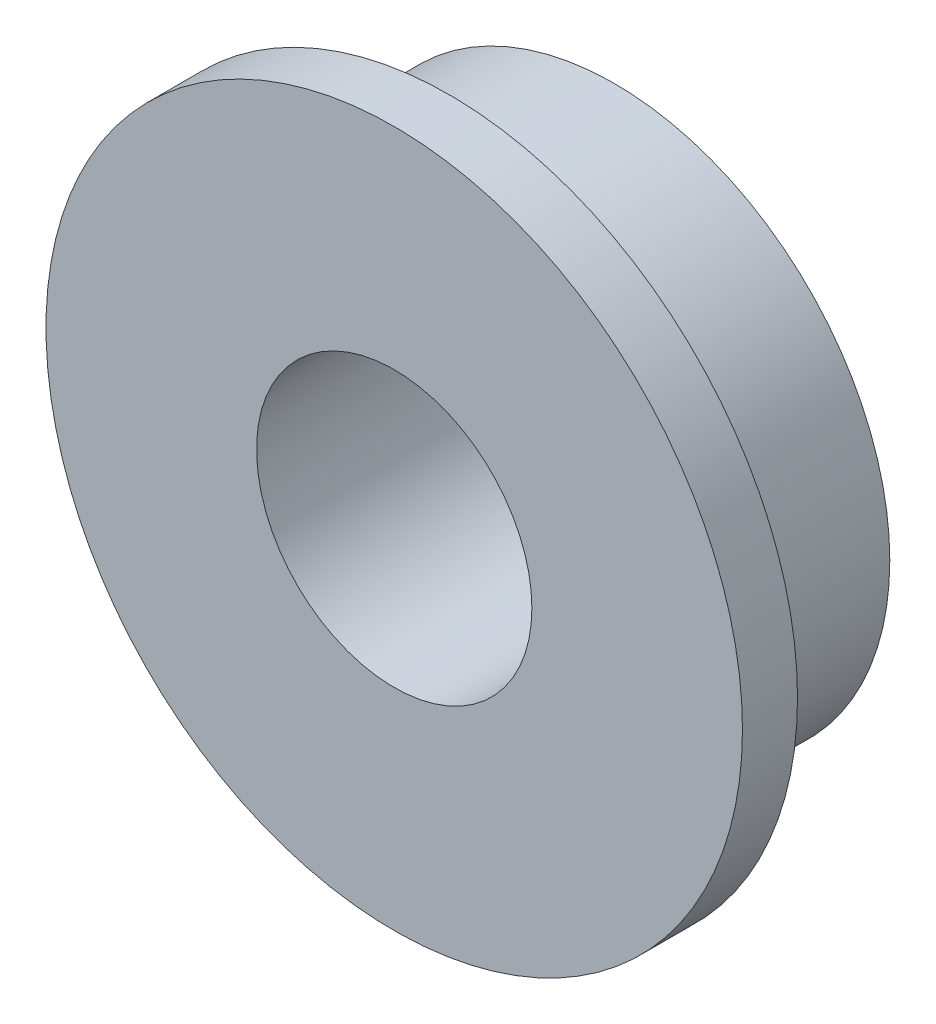
ISO-10303-21;
HEADER;
FILE_DESCRIPTION(('STEP AP214'),'2;1');
FILE_NAME('part.step','',(''),(''),'','','');
FILE_SCHEMA(('AUTOMOTIVE_DESIGN { 1 0 10303 214 1 1 1 1 }'));
ENDSEC;
DATA;
#1=APPLICATION_CONTEXT('core data for automotive mechanical design processes');
#2=APPLICATION_PROTOCOL_DEFINITION('international standard','automotive_design',2000,#1);
#3=PRODUCT_CONTEXT('',#1,'mechanical');
#4=PRODUCT('Part','Part','',(#3));
#5=PRODUCT_RELATED_PRODUCT_CATEGORY('part','',(#4));
#6=PRODUCT_DEFINITION_FORMATION('','',#4);
#7=PRODUCT_DEFINITION_CONTEXT('part definition',#1,'design');
#8=PRODUCT_DEFINITION('design','',#6,#7);
#9=PRODUCT_DEFINITION_SHAPE('','',#8);
#10=(LENGTH_UNIT() NAMED_UNIT(*) SI_UNIT(.MILLI.,.METRE.));
#11=(NAMED_UNIT(*) PLANE_ANGLE_UNIT() SI_UNIT($,.RADIAN.));
#12=(NAMED_UNIT(*) SI_UNIT($,.STERADIAN.) SOLID_ANGLE_UNIT());
#13=UNCERTAINTY_MEASURE_WITH_UNIT(LENGTH_MEASURE(1.E-05),#10,'distance_accuracy_value','');
#14=(GEOMETRIC_REPRESENTATION_CONTEXT(3) GLOBAL_UNCERTAINTY_ASSIGNED_CONTEXT((#13)) GLOBAL_UNIT_ASSIGNED_CONTEXT((#10,
#11,#12)) REPRESENTATION_CONTEXT('',''));
#15=CARTESIAN_POINT('',(0.,0.,0.));
#16=DIRECTION('',(0.,0.,1.));
#17=DIRECTION('',(1.,0.,0.));
#18=AXIS2_PLACEMENT_3D('',#15,#16,#17);
#19=CARTESIAN_POINT('',(0.690540980360563,1.46891454845607,4.));
#20=DIRECTION('',(0.,0.,-1.));
#21=DIRECTION('',(-1.,0.,0.));
#22=AXIS2_PLACEMENT_3D('',#19,#20,#21);
#23=CYLINDRICAL_SURFACE('',#22,5.);
#24=CARTESIAN_POINT('',(0.690540980360563,1.46891454845607,0.));
#25=DIRECTION('',(0.,0.,1.));
#26=DIRECTION('',(1.,0.,0.));
#27=AXIS2_PLACEMENT_3D('',#24,#25,#26);
#28=CIRCLE('',#27,5.);
#29=CARTESIAN_POINT('',(5.69054098036056,1.46891454845607,0.));
#30=VERTEX_POINT('',#29);
#31=EDGE_CURVE('E34',#30,#30,#28,.T.);
#32=ORIENTED_EDGE('',*,*,#31,.T.);
#33=EDGE_LOOP('',(#32));
#34=FACE_BOUND('',#33,.T.);
#35=CARTESIAN_POINT('',(0.690540980360563,1.46891454845607,3.));
#36=DIRECTION('',(0.,0.,1.));
#37=DIRECTION('',(1.,0.,0.));
#38=AXIS2_PLACEMENT_3D('',#35,#36,#37);
#39=CIRCLE('',#38,5.);
#40=CARTESIAN_POINT('',(5.69054098036056,1.46891454845607,3.));
#41=VERTEX_POINT('',#40);
#42=EDGE_CURVE('E10',#41,#41,#39,.T.);
#43=ORIENTED_EDGE('',*,*,#42,.F.);
#44=EDGE_LOOP('',(#43));
#45=FACE_BOUND('',#44,.T.);
#46=ADVANCED_FACE('F31',(#34,#45),#23,.T.);
#47=CARTESIAN_POINT('',(0.690540980360563,1.46891454845607,4.));
#48=DIRECTION('',(0.,0.,1.));
#49=DIRECTION('',(1.,0.,0.));
#50=AXIS2_PLACEMENT_3D('',#47,#48,#49);
#51=PLANE('',#50);
#52=CARTESIAN_POINT('',(0.690540980360563,1.46891454845607,4.));
#53=DIRECTION('',(0.,0.,1.));
#54=DIRECTION('',(1.,0.,0.));
#55=AXIS2_PLACEMENT_3D('',#52,#53,#54);
#56=CIRCLE('',#55,2.5);
#57=CARTESIAN_POINT('',(3.19054098036056,1.46891454845607,4.));
#58=VERTEX_POINT('',#57);
#59=EDGE_CURVE('E42',#58,#58,#56,.T.);
#60=ORIENTED_EDGE('',*,*,#59,.F.);
#61=EDGE_LOOP('',(#60));
#62=FACE_BOUND('',#61,.T.);
#63=CARTESIAN_POINT('',(0.690540980360563,1.46891454845607,4.));
#64=DIRECTION('',(0.,0.,1.));
#65=DIRECTION('',(1.,0.,0.));
#66=AXIS2_PLACEMENT_3D('',#63,#64,#65);
#67=CIRCLE('',#66,6.32420063757325);
#68=CARTESIAN_POINT('',(7.01474161793381,1.46891454845607,4.));
#69=VERTEX_POINT('',#68);
#70=EDGE_CURVE('E45',#69,#69,#67,.T.);
#71=ORIENTED_EDGE('',*,*,#70,.T.);
#72=EDGE_LOOP('',(#71));
#73=FACE_BOUND('',#72,.T.);
#74=ADVANCED_FACE('F59',(#62,#73),#51,.T.);
#75=CARTESIAN_POINT('',(0.690540980360563,1.46891454845607,0.));
#76=DIRECTION('',(0.,0.,1.));
#77=DIRECTION('',(1.,0.,0.));
#78=AXIS2_PLACEMENT_3D('',#75,#76,#77);
#79=PLANE('',#78);
#80=ORIENTED_EDGE('',*,*,#31,.F.);
#81=EDGE_LOOP('',(#80));
#82=FACE_BOUND('',#81,.T.);
#83=CARTESIAN_POINT('',(0.690540980360563,1.46891454845607,0.));
#84=DIRECTION('',(0.,0.,1.));
#85=DIRECTION('',(1.,0.,0.));
#86=AXIS2_PLACEMENT_3D('',#83,#84,#85);
#87=CIRCLE('',#86,2.5);
#88=CARTESIAN_POINT('',(3.19054098036056,1.46891454845607,0.));
#89=VERTEX_POINT('',#88);
#90=EDGE_CURVE('E48',#89,#89,#87,.T.);
#91=ORIENTED_EDGE('',*,*,#90,.T.);
#92=EDGE_LOOP('',(#91));
#93=FACE_BOUND('',#92,.T.);
#94=ADVANCED_FACE('F77',(#82,#93),#79,.F.);
#95=CARTESIAN_POINT('',(0.690540980360563,1.46891454845607,4.));
#96=DIRECTION('',(0.,0.,-1.));
#97=DIRECTION('',(-1.,0.,0.));
#98=AXIS2_PLACEMENT_3D('',#95,#96,#97);
#99=CYLINDRICAL_SURFACE('',#98,2.5);
#100=ORIENTED_EDGE('',*,*,#59,.T.);
#101=EDGE_LOOP('',(#100));
#102=FACE_BOUND('',#101,.T.);
#103=ORIENTED_EDGE('',*,*,#90,.F.);
#104=EDGE_LOOP('',(#103));
#105=FACE_BOUND('',#104,.T.);
#106=ADVANCED_FACE('F68',(#102,#105),#99,.F.);
#107=CARTESIAN_POINT('',(0.690540980360563,1.46891454845607,3.));
#108=DIRECTION('',(0.,0.,1.));
#109=DIRECTION('',(1.,0.,0.));
#110=AXIS2_PLACEMENT_3D('',#107,#108,#109);
#111=PLANE('',#110);
#112=CARTESIAN_POINT('',(0.690540980360563,1.46891454845607,3.));
#113=DIRECTION('',(0.,0.,1.));
#114=DIRECTION('',(1.,0.,0.));
#115=AXIS2_PLACEMENT_3D('',#112,#113,#114);
#116=CIRCLE('',#115,6.32420063757325);
#117=CARTESIAN_POINT('',(7.01474161793381,1.46891454845607,3.));
#118=VERTEX_POINT('',#117);
#119=EDGE_CURVE('E50',#118,#118,#116,.T.);
#120=ORIENTED_EDGE('',*,*,#119,.F.);
#121=EDGE_LOOP('',(#120));
#122=FACE_BOUND('',#121,.T.);
#123=ORIENTED_EDGE('',*,*,#42,.T.);
#124=EDGE_LOOP('',(#123));
#125=FACE_BOUND('',#124,.T.);
#126=ADVANCED_FACE('F63',(#122,#125),#111,.F.);
#127=CARTESIAN_POINT('',(0.690540980360563,1.46891454845607,3.));
#128=DIRECTION('',(0.,0.,1.));
#129=DIRECTION('',(1.,0.,0.));
#130=AXIS2_PLACEMENT_3D('',#127,#128,#129);
#131=CYLINDRICAL_SURFACE('',#130,6.32420063757325);
#132=ORIENTED_EDGE('',*,*,#119,.T.);
#133=EDGE_LOOP('',(#132));
#134=FACE_BOUND('',#133,.T.);
#135=ORIENTED_EDGE('',*,*,#70,.F.);
#136=EDGE_LOOP('',(#135));
#137=FACE_BOUND('',#136,.T.);
#138=ADVANCED_FACE('F61',(#134,#137),#131,.T.);
#139=CLOSED_SHELL('',(#46,#74,#94,#106,#126,#138));
#140=MANIFOLD_SOLID_BREP('B2',#139);
#141=ADVANCED_BREP_SHAPE_REPRESENTATION('',(#18,#140),#14);
#142=SHAPE_DEFINITION_REPRESENTATION(#9,#141);
ENDSEC;
END-ISO-10303-21;
